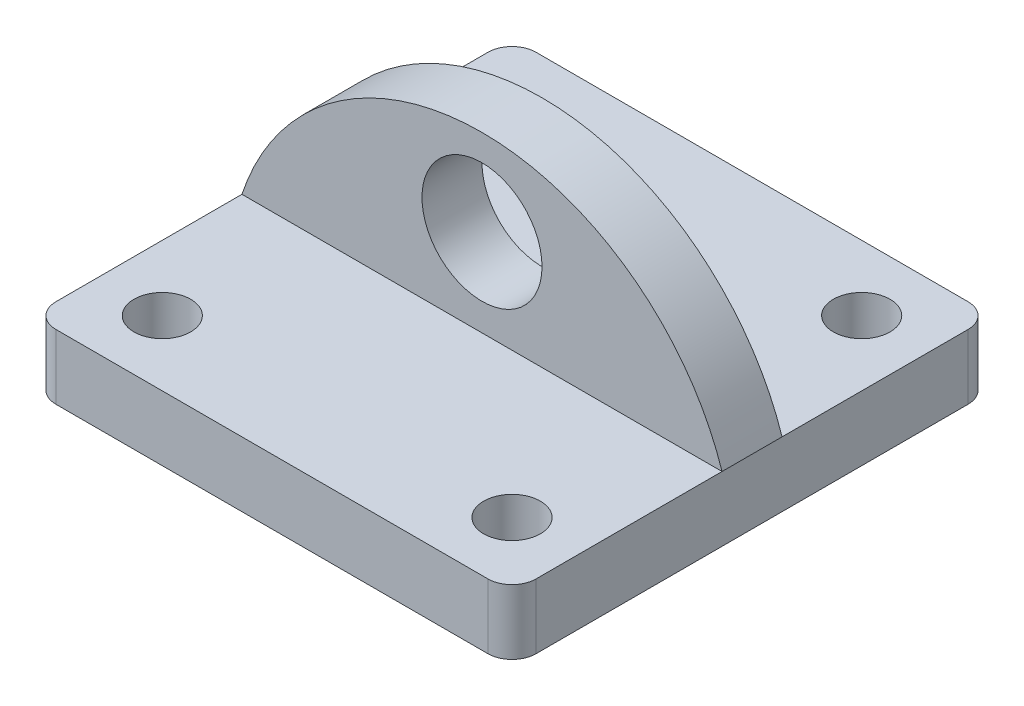
ISO-10303-21;
HEADER;
FILE_DESCRIPTION(('STEP AP214'),'2;1');
FILE_NAME('part.step','',(''),(''),'','','');
FILE_SCHEMA(('AUTOMOTIVE_DESIGN { 1 0 10303 214 1 1 1 1 }'));
ENDSEC;
DATA;
#1=APPLICATION_CONTEXT('core data for automotive mechanical design processes');
#2=APPLICATION_PROTOCOL_DEFINITION('international standard','automotive_design',2000,#1);
#3=PRODUCT_CONTEXT('',#1,'mechanical');
#4=PRODUCT('Part','Part','',(#3));
#5=PRODUCT_RELATED_PRODUCT_CATEGORY('part','',(#4));
#6=PRODUCT_DEFINITION_FORMATION('','',#4);
#7=PRODUCT_DEFINITION_CONTEXT('part definition',#1,'design');
#8=PRODUCT_DEFINITION('design','',#6,#7);
#9=PRODUCT_DEFINITION_SHAPE('','',#8);
#10=(LENGTH_UNIT() NAMED_UNIT(*) SI_UNIT(.MILLI.,.METRE.));
#11=(NAMED_UNIT(*) PLANE_ANGLE_UNIT() SI_UNIT($,.RADIAN.));
#12=(NAMED_UNIT(*) SI_UNIT($,.STERADIAN.) SOLID_ANGLE_UNIT());
#13=UNCERTAINTY_MEASURE_WITH_UNIT(LENGTH_MEASURE(1.E-05),#10,'distance_accuracy_value','');
#14=(GEOMETRIC_REPRESENTATION_CONTEXT(3) GLOBAL_UNCERTAINTY_ASSIGNED_CONTEXT((#13)) GLOBAL_UNIT_ASSIGNED_CONTEXT((#10,
#11,#12)) REPRESENTATION_CONTEXT('',''));
#15=CARTESIAN_POINT('',(0.,0.,0.));
#16=DIRECTION('',(0.,0.,1.));
#17=DIRECTION('',(1.,0.,0.));
#18=AXIS2_PLACEMENT_3D('',#15,#16,#17);
#19=CARTESIAN_POINT('',(0.,-1.51143345808905,-15.367));
#20=DIRECTION('',(0.,0.,1.));
#21=DIRECTION('',(1.,0.,0.));
#22=AXIS2_PLACEMENT_3D('',#19,#20,#21);
#23=CYLINDRICAL_SURFACE('',#22,26.7433620999563);
#24=DIRECTION('',(0.,0.,1.));
#25=VECTOR('',#24,1.);
#26=CARTESIAN_POINT('',(25.4,6.858,-15.367));
#27=LINE('',#26,#25);
#28=CARTESIAN_POINT('',(25.4,6.858,-3.17500000000001));
#29=VERTEX_POINT('',#28);
#30=CARTESIAN_POINT('',(25.4,6.85799999999999,3.17499999999999));
#31=VERTEX_POINT('',#30);
#32=EDGE_CURVE('E231',#29,#31,#27,.T.);
#33=ORIENTED_EDGE('',*,*,#32,.F.);
#34=CARTESIAN_POINT('',(0.,-1.51143345808905,-3.17500000000001));
#35=DIRECTION('',(0.,0.,-1.));
#36=DIRECTION('',(0.,1.,0.));
#37=AXIS2_PLACEMENT_3D('',#34,#35,#36);
#38=CIRCLE('',#37,26.7433620999563);
#39=CARTESIAN_POINT('',(-25.4,6.858,-3.17500000000001));
#40=VERTEX_POINT('',#39);
#41=EDGE_CURVE('E12',#40,#29,#38,.T.);
#42=ORIENTED_EDGE('',*,*,#41,.F.);
#43=DIRECTION('',(0.,0.,1.));
#44=VECTOR('',#43,1.);
#45=CARTESIAN_POINT('',(-25.4,6.858,-15.367));
#46=LINE('',#45,#44);
#47=CARTESIAN_POINT('',(-25.4,6.858,3.17499999999999));
#48=VERTEX_POINT('',#47);
#49=EDGE_CURVE('E232',#40,#48,#46,.T.);
#50=ORIENTED_EDGE('',*,*,#49,.T.);
#51=CARTESIAN_POINT('',(0.,-1.51143345808905,3.17499999999999));
#52=DIRECTION('',(0.,0.,-1.));
#53=DIRECTION('',(0.,1.,0.));
#54=AXIS2_PLACEMENT_3D('',#51,#52,#53);
#55=CIRCLE('',#54,26.7433620999563);
#56=EDGE_CURVE('E70',#48,#31,#55,.T.);
#57=ORIENTED_EDGE('',*,*,#56,.T.);
#58=EDGE_LOOP('',(#33,#42,#50,#57));
#59=FACE_BOUND('',#58,.T.);
#60=ADVANCED_FACE('F61',(#59),#23,.T.);
#61=CARTESIAN_POINT('',(-22.86,6.858,22.86));
#62=DIRECTION('',(0.,1.,0.));
#63=DIRECTION('',(0.,0.,1.));
#64=AXIS2_PLACEMENT_3D('',#61,#62,#63);
#65=PLANE('',#64);
#66=DIRECTION('',(0.,0.,1.));
#67=VECTOR('',#66,1.);
#68=CARTESIAN_POINT('',(-25.4,6.858,22.86));
#69=LINE('',#68,#67);
#70=CARTESIAN_POINT('',(-25.4,6.858,-22.86));
#71=VERTEX_POINT('',#70);
#72=EDGE_CURVE('E170',#71,#40,#69,.T.);
#73=ORIENTED_EDGE('',*,*,#72,.T.);
#74=DIRECTION('',(-1.,0.,0.));
#75=VECTOR('',#74,1.);
#76=CARTESIAN_POINT('',(32.766,6.858,-3.17500000000001));
#77=LINE('',#76,#75);
#78=EDGE_CURVE('E240',#29,#40,#77,.T.);
#79=ORIENTED_EDGE('',*,*,#78,.F.);
#80=DIRECTION('',(0.,0.,-1.));
#81=VECTOR('',#80,1.);
#82=CARTESIAN_POINT('',(25.4,6.858,22.86));
#83=LINE('',#82,#81);
#84=CARTESIAN_POINT('',(25.4,6.858,-22.86));
#85=VERTEX_POINT('',#84);
#86=EDGE_CURVE('E248',#29,#85,#83,.T.);
#87=ORIENTED_EDGE('',*,*,#86,.T.);
#88=CARTESIAN_POINT('',(22.86,6.858,-22.86));
#89=DIRECTION('',(0.,1.,0.));
#90=DIRECTION('',(0.,0.,1.));
#91=AXIS2_PLACEMENT_3D('',#88,#89,#90);
#92=CIRCLE('',#91,2.54);
#93=CARTESIAN_POINT('',(22.86,6.858,-25.4));
#94=VERTEX_POINT('',#93);
#95=EDGE_CURVE('E148',#85,#94,#92,.T.);
#96=ORIENTED_EDGE('',*,*,#95,.T.);
#97=DIRECTION('',(-1.,0.,0.));
#98=VECTOR('',#97,1.);
#99=CARTESIAN_POINT('',(22.86,6.858,-25.4));
#100=LINE('',#99,#98);
#101=CARTESIAN_POINT('',(-22.86,6.858,-25.4));
#102=VERTEX_POINT('',#101);
#103=EDGE_CURVE('E139',#94,#102,#100,.T.);
#104=ORIENTED_EDGE('',*,*,#103,.T.);
#105=CARTESIAN_POINT('',(-22.86,6.858,-22.86));
#106=DIRECTION('',(0.,1.,0.));
#107=DIRECTION('',(0.,0.,1.));
#108=AXIS2_PLACEMENT_3D('',#105,#106,#107);
#109=CIRCLE('',#108,2.54);
#110=EDGE_CURVE('E145',#102,#71,#109,.T.);
#111=ORIENTED_EDGE('',*,*,#110,.T.);
#112=EDGE_LOOP('',(#73,#79,#87,#96,#104,#111));
#113=FACE_BOUND('',#112,.T.);
#114=CARTESIAN_POINT('',(18.499963,6.858,-18.499963));
#115=DIRECTION('',(0.,1.,0.));
#116=DIRECTION('',(0.,0.,1.));
#117=AXIS2_PLACEMENT_3D('',#114,#115,#116);
#118=CIRCLE('',#117,2.999994);
#119=CARTESIAN_POINT('',(18.499963,6.858,-15.499969));
#120=VERTEX_POINT('',#119);
#121=EDGE_CURVE('E275',#120,#120,#118,.T.);
#122=ORIENTED_EDGE('',*,*,#121,.F.);
#123=EDGE_LOOP('',(#122));
#124=FACE_BOUND('',#123,.T.);
#125=CARTESIAN_POINT('',(-18.499963,6.858,-18.499963));
#126=DIRECTION('',(0.,1.,0.));
#127=DIRECTION('',(0.,0.,1.));
#128=AXIS2_PLACEMENT_3D('',#125,#126,#127);
#129=CIRCLE('',#128,2.999994);
#130=CARTESIAN_POINT('',(-18.499963,6.858,-15.499969));
#131=VERTEX_POINT('',#130);
#132=EDGE_CURVE('E181',#131,#131,#129,.T.);
#133=ORIENTED_EDGE('',*,*,#132,.F.);
#134=EDGE_LOOP('',(#133));
#135=FACE_BOUND('',#134,.T.);
#136=ADVANCED_FACE('F142',(#113,#124,#135),#65,.T.);
#137=CARTESIAN_POINT('',(25.4,6.858,22.86));
#138=VERTEX_POINT('',#137);
#139=EDGE_CURVE('E246',#138,#31,#83,.T.);
#140=ORIENTED_EDGE('',*,*,#139,.T.);
#141=DIRECTION('',(-1.,0.,0.));
#142=VECTOR('',#141,1.);
#143=CARTESIAN_POINT('',(32.766,6.858,3.17499999999999));
#144=LINE('',#143,#142);
#145=EDGE_CURVE('E236',#31,#48,#144,.T.);
#146=ORIENTED_EDGE('',*,*,#145,.T.);
#147=CARTESIAN_POINT('',(-25.4,6.858,22.86));
#148=VERTEX_POINT('',#147);
#149=EDGE_CURVE('E77',#48,#148,#69,.T.);
#150=ORIENTED_EDGE('',*,*,#149,.T.);
#151=CARTESIAN_POINT('',(-22.86,6.858,22.86));
#152=DIRECTION('',(0.,1.,0.));
#153=DIRECTION('',(0.,0.,1.));
#154=AXIS2_PLACEMENT_3D('',#151,#152,#153);
#155=CIRCLE('',#154,2.54);
#156=CARTESIAN_POINT('',(-22.86,6.858,25.4));
#157=VERTEX_POINT('',#156);
#158=EDGE_CURVE('E200',#148,#157,#155,.T.);
#159=ORIENTED_EDGE('',*,*,#158,.T.);
#160=DIRECTION('',(1.,0.,0.));
#161=VECTOR('',#160,1.);
#162=CARTESIAN_POINT('',(22.86,6.858,25.4));
#163=LINE('',#162,#161);
#164=CARTESIAN_POINT('',(22.86,6.858,25.4));
#165=VERTEX_POINT('',#164);
#166=EDGE_CURVE('E123',#157,#165,#163,.T.);
#167=ORIENTED_EDGE('',*,*,#166,.T.);
#168=CARTESIAN_POINT('',(22.86,6.858,22.86));
#169=DIRECTION('',(0.,1.,0.));
#170=DIRECTION('',(0.,0.,-1.));
#171=AXIS2_PLACEMENT_3D('',#168,#169,#170);
#172=CIRCLE('',#171,2.54);
#173=EDGE_CURVE('E293',#165,#138,#172,.T.);
#174=ORIENTED_EDGE('',*,*,#173,.T.);
#175=EDGE_LOOP('',(#140,#146,#150,#159,#167,#174));
#176=FACE_BOUND('',#175,.T.);
#177=CARTESIAN_POINT('',(18.499963,6.858,18.499963));
#178=DIRECTION('',(0.,1.,0.));
#179=DIRECTION('',(0.,0.,1.));
#180=AXIS2_PLACEMENT_3D('',#177,#178,#179);
#181=CIRCLE('',#180,2.999994);
#182=CARTESIAN_POINT('',(18.499963,6.858,21.499957));
#183=VERTEX_POINT('',#182);
#184=EDGE_CURVE('E267',#183,#183,#181,.T.);
#185=ORIENTED_EDGE('',*,*,#184,.F.);
#186=EDGE_LOOP('',(#185));
#187=FACE_BOUND('',#186,.T.);
#188=CARTESIAN_POINT('',(-18.499963,6.858,18.499963));
#189=DIRECTION('',(0.,1.,0.));
#190=DIRECTION('',(0.,0.,1.));
#191=AXIS2_PLACEMENT_3D('',#188,#189,#190);
#192=CIRCLE('',#191,2.999994);
#193=CARTESIAN_POINT('',(-18.499963,6.858,21.499957));
#194=VERTEX_POINT('',#193);
#195=EDGE_CURVE('E256',#194,#194,#192,.T.);
#196=ORIENTED_EDGE('',*,*,#195,.F.);
#197=EDGE_LOOP('',(#196));
#198=FACE_BOUND('',#197,.T.);
#199=ADVANCED_FACE('F338',(#176,#187,#198),#65,.T.);
#200=CARTESIAN_POINT('',(-22.86,0.,22.86));
#201=DIRECTION('',(0.,1.,0.));
#202=DIRECTION('',(0.,0.,1.));
#203=AXIS2_PLACEMENT_3D('',#200,#201,#202);
#204=PLANE('',#203);
#205=CARTESIAN_POINT('',(-22.86,0.,22.86));
#206=DIRECTION('',(0.,1.,0.));
#207=DIRECTION('',(0.,0.,1.));
#208=AXIS2_PLACEMENT_3D('',#205,#206,#207);
#209=CIRCLE('',#208,2.54);
#210=CARTESIAN_POINT('',(-25.4,0.,22.86));
#211=VERTEX_POINT('',#210);
#212=CARTESIAN_POINT('',(-22.86,0.,25.4));
#213=VERTEX_POINT('',#212);
#214=EDGE_CURVE('E176',#211,#213,#209,.T.);
#215=ORIENTED_EDGE('',*,*,#214,.F.);
#216=DIRECTION('',(0.,0.,1.));
#217=VECTOR('',#216,1.);
#218=CARTESIAN_POINT('',(-25.4,0.,22.86));
#219=LINE('',#218,#217);
#220=CARTESIAN_POINT('',(-25.4,0.,-22.86));
#221=VERTEX_POINT('',#220);
#222=EDGE_CURVE('E114',#221,#211,#219,.T.);
#223=ORIENTED_EDGE('',*,*,#222,.F.);
#224=CARTESIAN_POINT('',(-22.86,0.,-22.86));
#225=DIRECTION('',(0.,1.,0.));
#226=DIRECTION('',(0.,0.,1.));
#227=AXIS2_PLACEMENT_3D('',#224,#225,#226);
#228=CIRCLE('',#227,2.54);
#229=CARTESIAN_POINT('',(-22.86,0.,-25.4));
#230=VERTEX_POINT('',#229);
#231=EDGE_CURVE('E195',#230,#221,#228,.T.);
#232=ORIENTED_EDGE('',*,*,#231,.F.);
#233=DIRECTION('',(-1.,0.,0.));
#234=VECTOR('',#233,1.);
#235=CARTESIAN_POINT('',(22.86,0.,-25.4));
#236=LINE('',#235,#234);
#237=CARTESIAN_POINT('',(22.86,0.,-25.4));
#238=VERTEX_POINT('',#237);
#239=EDGE_CURVE('E158',#238,#230,#236,.T.);
#240=ORIENTED_EDGE('',*,*,#239,.F.);
#241=CARTESIAN_POINT('',(22.86,0.,-22.86));
#242=DIRECTION('',(0.,1.,0.));
#243=DIRECTION('',(0.,0.,1.));
#244=AXIS2_PLACEMENT_3D('',#241,#242,#243);
#245=CIRCLE('',#244,2.54);
#246=CARTESIAN_POINT('',(25.4,0.,-22.86));
#247=VERTEX_POINT('',#246);
#248=EDGE_CURVE('E190',#247,#238,#245,.T.);
#249=ORIENTED_EDGE('',*,*,#248,.F.);
#250=DIRECTION('',(0.,0.,-1.));
#251=VECTOR('',#250,1.);
#252=CARTESIAN_POINT('',(25.4,0.,22.86));
#253=LINE('',#252,#251);
#254=CARTESIAN_POINT('',(25.4,0.,22.86));
#255=VERTEX_POINT('',#254);
#256=EDGE_CURVE('E187',#255,#247,#253,.T.);
#257=ORIENTED_EDGE('',*,*,#256,.F.);
#258=CARTESIAN_POINT('',(22.86,0.,22.86));
#259=DIRECTION('',(0.,1.,0.));
#260=DIRECTION('',(0.,0.,-1.));
#261=AXIS2_PLACEMENT_3D('',#258,#259,#260);
#262=CIRCLE('',#261,2.54);
#263=CARTESIAN_POINT('',(22.86,0.,25.4));
#264=VERTEX_POINT('',#263);
#265=EDGE_CURVE('E184',#264,#255,#262,.T.);
#266=ORIENTED_EDGE('',*,*,#265,.F.);
#267=DIRECTION('',(1.,0.,0.));
#268=VECTOR('',#267,1.);
#269=CARTESIAN_POINT('',(22.86,0.,25.4));
#270=LINE('',#269,#268);
#271=EDGE_CURVE('E180',#213,#264,#270,.T.);
#272=ORIENTED_EDGE('',*,*,#271,.F.);
#273=EDGE_LOOP('',(#215,#223,#232,#240,#249,#257,#266,#272));
#274=FACE_BOUND('',#273,.T.);
#275=CARTESIAN_POINT('',(-18.499963,0.,-18.499963));
#276=DIRECTION('',(0.,1.,0.));
#277=DIRECTION('',(0.,0.,1.));
#278=AXIS2_PLACEMENT_3D('',#275,#276,#277);
#279=CIRCLE('',#278,2.999994);
#280=CARTESIAN_POINT('',(-18.499963,0.,-15.499969));
#281=VERTEX_POINT('',#280);
#282=EDGE_CURVE('E279',#281,#281,#279,.T.);
#283=ORIENTED_EDGE('',*,*,#282,.T.);
#284=EDGE_LOOP('',(#283));
#285=FACE_BOUND('',#284,.T.);
#286=CARTESIAN_POINT('',(18.499963,0.,-18.499963));
#287=DIRECTION('',(0.,1.,0.));
#288=DIRECTION('',(0.,0.,1.));
#289=AXIS2_PLACEMENT_3D('',#286,#287,#288);
#290=CIRCLE('',#289,2.999994);
#291=CARTESIAN_POINT('',(18.499963,0.,-15.499969));
#292=VERTEX_POINT('',#291);
#293=EDGE_CURVE('E271',#292,#292,#290,.T.);
#294=ORIENTED_EDGE('',*,*,#293,.T.);
#295=EDGE_LOOP('',(#294));
#296=FACE_BOUND('',#295,.T.);
#297=CARTESIAN_POINT('',(18.499963,0.,18.499963));
#298=DIRECTION('',(0.,1.,0.));
#299=DIRECTION('',(0.,0.,1.));
#300=AXIS2_PLACEMENT_3D('',#297,#298,#299);
#301=CIRCLE('',#300,2.999994);
#302=CARTESIAN_POINT('',(18.499963,0.,21.499957));
#303=VERTEX_POINT('',#302);
#304=EDGE_CURVE('E265',#303,#303,#301,.T.);
#305=ORIENTED_EDGE('',*,*,#304,.T.);
#306=EDGE_LOOP('',(#305));
#307=FACE_BOUND('',#306,.T.);
#308=CARTESIAN_POINT('',(-18.499963,0.,18.499963));
#309=DIRECTION('',(0.,1.,0.));
#310=DIRECTION('',(0.,0.,1.));
#311=AXIS2_PLACEMENT_3D('',#308,#309,#310);
#312=CIRCLE('',#311,2.999994);
#313=CARTESIAN_POINT('',(-18.499963,0.,21.499957));
#314=VERTEX_POINT('',#313);
#315=EDGE_CURVE('E251',#314,#314,#312,.T.);
#316=ORIENTED_EDGE('',*,*,#315,.T.);
#317=EDGE_LOOP('',(#316));
#318=FACE_BOUND('',#317,.T.);
#319=ADVANCED_FACE('F306',(#274,#285,#296,#307,#318),#204,.F.);
#320=CARTESIAN_POINT('',(-22.86,6.858,22.86));
#321=DIRECTION('',(0.,-1.,0.));
#322=DIRECTION('',(0.,0.,-1.));
#323=AXIS2_PLACEMENT_3D('',#320,#321,#322);
#324=CYLINDRICAL_SURFACE('',#323,2.54);
#325=ORIENTED_EDGE('',*,*,#214,.T.);
#326=DIRECTION('',(0.,-1.,0.));
#327=VECTOR('',#326,1.);
#328=CARTESIAN_POINT('',(-22.86,6.858,25.4));
#329=LINE('',#328,#327);
#330=EDGE_CURVE('E219',#157,#213,#329,.T.);
#331=ORIENTED_EDGE('',*,*,#330,.F.);
#332=ORIENTED_EDGE('',*,*,#158,.F.);
#333=DIRECTION('',(0.,-1.,0.));
#334=VECTOR('',#333,1.);
#335=CARTESIAN_POINT('',(-25.4,6.858,22.86));
#336=LINE('',#335,#334);
#337=EDGE_CURVE('E175',#148,#211,#336,.T.);
#338=ORIENTED_EDGE('',*,*,#337,.T.);
#339=EDGE_LOOP('',(#325,#331,#332,#338));
#340=FACE_BOUND('',#339,.T.);
#341=ADVANCED_FACE('F63',(#340),#324,.T.);
#342=CARTESIAN_POINT('',(22.86,6.858,25.4));
#343=DIRECTION('',(0.,0.,-1.));
#344=DIRECTION('',(-1.,0.,0.));
#345=AXIS2_PLACEMENT_3D('',#342,#343,#344);
#346=PLANE('',#345);
#347=ORIENTED_EDGE('',*,*,#271,.T.);
#348=DIRECTION('',(0.,-1.,0.));
#349=VECTOR('',#348,1.);
#350=CARTESIAN_POINT('',(22.86,6.858,25.4));
#351=LINE('',#350,#349);
#352=EDGE_CURVE('E215',#165,#264,#351,.T.);
#353=ORIENTED_EDGE('',*,*,#352,.F.);
#354=ORIENTED_EDGE('',*,*,#166,.F.);
#355=ORIENTED_EDGE('',*,*,#330,.T.);
#356=EDGE_LOOP('',(#347,#353,#354,#355));
#357=FACE_BOUND('',#356,.T.);
#358=ADVANCED_FACE('F377',(#357),#346,.F.);
#359=CARTESIAN_POINT('',(22.86,6.858,22.86));
#360=DIRECTION('',(0.,-1.,0.));
#361=DIRECTION('',(0.,0.,-1.));
#362=AXIS2_PLACEMENT_3D('',#359,#360,#361);
#363=CYLINDRICAL_SURFACE('',#362,2.54);
#364=ORIENTED_EDGE('',*,*,#265,.T.);
#365=DIRECTION('',(0.,-1.,0.));
#366=VECTOR('',#365,1.);
#367=CARTESIAN_POINT('',(25.4,6.858,22.86));
#368=LINE('',#367,#366);
#369=EDGE_CURVE('E211',#138,#255,#368,.T.);
#370=ORIENTED_EDGE('',*,*,#369,.F.);
#371=ORIENTED_EDGE('',*,*,#173,.F.);
#372=ORIENTED_EDGE('',*,*,#352,.T.);
#373=EDGE_LOOP('',(#364,#370,#371,#372));
#374=FACE_BOUND('',#373,.T.);
#375=ADVANCED_FACE('F375',(#374),#363,.T.);
#376=CARTESIAN_POINT('',(25.4,6.858,22.86));
#377=DIRECTION('',(-1.,0.,0.));
#378=DIRECTION('',(0.,0.,1.));
#379=AXIS2_PLACEMENT_3D('',#376,#377,#378);
#380=PLANE('',#379);
#381=ORIENTED_EDGE('',*,*,#86,.F.);
#382=ORIENTED_EDGE('',*,*,#32,.T.);
#383=ORIENTED_EDGE('',*,*,#139,.F.);
#384=ORIENTED_EDGE('',*,*,#369,.T.);
#385=ORIENTED_EDGE('',*,*,#256,.T.);
#386=DIRECTION('',(0.,-1.,0.));
#387=VECTOR('',#386,1.);
#388=CARTESIAN_POINT('',(25.4,6.858,-22.86));
#389=LINE('',#388,#387);
#390=EDGE_CURVE('E207',#85,#247,#389,.T.);
#391=ORIENTED_EDGE('',*,*,#390,.F.);
#392=EDGE_LOOP('',(#381,#382,#383,#384,#385,#391));
#393=FACE_BOUND('',#392,.T.);
#394=ADVANCED_FACE('F245',(#393),#380,.F.);
#395=CARTESIAN_POINT('',(22.86,6.858,-22.86));
#396=DIRECTION('',(0.,-1.,0.));
#397=DIRECTION('',(0.,0.,-1.));
#398=AXIS2_PLACEMENT_3D('',#395,#396,#397);
#399=CYLINDRICAL_SURFACE('',#398,2.54);
#400=ORIENTED_EDGE('',*,*,#248,.T.);
#401=DIRECTION('',(0.,-1.,0.));
#402=VECTOR('',#401,1.);
#403=CARTESIAN_POINT('',(22.86,6.858,-25.4));
#404=LINE('',#403,#402);
#405=EDGE_CURVE('E162',#94,#238,#404,.T.);
#406=ORIENTED_EDGE('',*,*,#405,.F.);
#407=ORIENTED_EDGE('',*,*,#95,.F.);
#408=ORIENTED_EDGE('',*,*,#390,.T.);
#409=EDGE_LOOP('',(#400,#406,#407,#408));
#410=FACE_BOUND('',#409,.T.);
#411=ADVANCED_FACE('F303',(#410),#399,.T.);
#412=CARTESIAN_POINT('',(22.86,6.858,-25.4));
#413=DIRECTION('',(0.,0.,1.));
#414=DIRECTION('',(1.,0.,0.));
#415=AXIS2_PLACEMENT_3D('',#412,#413,#414);
#416=PLANE('',#415);
#417=ORIENTED_EDGE('',*,*,#239,.T.);
#418=DIRECTION('',(0.,-1.,0.));
#419=VECTOR('',#418,1.);
#420=CARTESIAN_POINT('',(-22.86,6.858,-25.4));
#421=LINE('',#420,#419);
#422=EDGE_CURVE('E155',#102,#230,#421,.T.);
#423=ORIENTED_EDGE('',*,*,#422,.F.);
#424=ORIENTED_EDGE('',*,*,#103,.F.);
#425=ORIENTED_EDGE('',*,*,#405,.T.);
#426=EDGE_LOOP('',(#417,#423,#424,#425));
#427=FACE_BOUND('',#426,.T.);
#428=ADVANCED_FACE('F156',(#427),#416,.F.);
#429=CARTESIAN_POINT('',(-22.86,6.858,-22.86));
#430=DIRECTION('',(0.,-1.,0.));
#431=DIRECTION('',(0.,0.,-1.));
#432=AXIS2_PLACEMENT_3D('',#429,#430,#431);
#433=CYLINDRICAL_SURFACE('',#432,2.54);
#434=ORIENTED_EDGE('',*,*,#231,.T.);
#435=DIRECTION('',(0.,-1.,0.));
#436=VECTOR('',#435,1.);
#437=CARTESIAN_POINT('',(-25.4,6.858,-22.86));
#438=LINE('',#437,#436);
#439=EDGE_CURVE('E163',#71,#221,#438,.T.);
#440=ORIENTED_EDGE('',*,*,#439,.F.);
#441=ORIENTED_EDGE('',*,*,#110,.F.);
#442=ORIENTED_EDGE('',*,*,#422,.T.);
#443=EDGE_LOOP('',(#434,#440,#441,#442));
#444=FACE_BOUND('',#443,.T.);
#445=ADVANCED_FACE('F165',(#444),#433,.T.);
#446=CARTESIAN_POINT('',(-25.4,6.858,22.86));
#447=DIRECTION('',(1.,0.,0.));
#448=DIRECTION('',(0.,0.,-1.));
#449=AXIS2_PLACEMENT_3D('',#446,#447,#448);
#450=PLANE('',#449);
#451=ORIENTED_EDGE('',*,*,#149,.F.);
#452=ORIENTED_EDGE('',*,*,#49,.F.);
#453=ORIENTED_EDGE('',*,*,#72,.F.);
#454=ORIENTED_EDGE('',*,*,#439,.T.);
#455=ORIENTED_EDGE('',*,*,#222,.T.);
#456=ORIENTED_EDGE('',*,*,#337,.F.);
#457=EDGE_LOOP('',(#451,#452,#453,#454,#455,#456));
#458=FACE_BOUND('',#457,.T.);
#459=ADVANCED_FACE('F308',(#458),#450,.F.);
#460=CARTESIAN_POINT('',(-18.499963,6.858,-18.499963));
#461=DIRECTION('',(0.,-1.,0.));
#462=DIRECTION('',(0.,0.,-1.));
#463=AXIS2_PLACEMENT_3D('',#460,#461,#462);
#464=CYLINDRICAL_SURFACE('',#463,2.999994);
#465=ORIENTED_EDGE('',*,*,#132,.T.);
#466=EDGE_LOOP('',(#465));
#467=FACE_BOUND('',#466,.T.);
#468=ORIENTED_EDGE('',*,*,#282,.F.);
#469=EDGE_LOOP('',(#468));
#470=FACE_BOUND('',#469,.T.);
#471=ADVANCED_FACE('F358',(#467,#470),#464,.F.);
#472=CARTESIAN_POINT('',(18.499963,6.858,-18.499963));
#473=DIRECTION('',(0.,-1.,0.));
#474=DIRECTION('',(0.,0.,-1.));
#475=AXIS2_PLACEMENT_3D('',#472,#473,#474);
#476=CYLINDRICAL_SURFACE('',#475,2.999994);
#477=ORIENTED_EDGE('',*,*,#121,.T.);
#478=EDGE_LOOP('',(#477));
#479=FACE_BOUND('',#478,.T.);
#480=ORIENTED_EDGE('',*,*,#293,.F.);
#481=EDGE_LOOP('',(#480));
#482=FACE_BOUND('',#481,.T.);
#483=ADVANCED_FACE('F351',(#479,#482),#476,.F.);
#484=CARTESIAN_POINT('',(18.499963,6.858,18.499963));
#485=DIRECTION('',(0.,-1.,0.));
#486=DIRECTION('',(0.,0.,-1.));
#487=AXIS2_PLACEMENT_3D('',#484,#485,#486);
#488=CYLINDRICAL_SURFACE('',#487,2.999994);
#489=ORIENTED_EDGE('',*,*,#184,.T.);
#490=EDGE_LOOP('',(#489));
#491=FACE_BOUND('',#490,.T.);
#492=ORIENTED_EDGE('',*,*,#304,.F.);
#493=EDGE_LOOP('',(#492));
#494=FACE_BOUND('',#493,.T.);
#495=ADVANCED_FACE('F346',(#491,#494),#488,.F.);
#496=CARTESIAN_POINT('',(-18.499963,6.858,18.499963));
#497=DIRECTION('',(0.,-1.,0.));
#498=DIRECTION('',(0.,0.,-1.));
#499=AXIS2_PLACEMENT_3D('',#496,#497,#498);
#500=CYLINDRICAL_SURFACE('',#499,2.999994);
#501=ORIENTED_EDGE('',*,*,#195,.T.);
#502=EDGE_LOOP('',(#501));
#503=FACE_BOUND('',#502,.T.);
#504=ORIENTED_EDGE('',*,*,#315,.F.);
#505=EDGE_LOOP('',(#504));
#506=FACE_BOUND('',#505,.T.);
#507=ADVANCED_FACE('F342',(#503,#506),#500,.F.);
#508=CARTESIAN_POINT('',(32.766,0.,3.17499999999999));
#509=DIRECTION('',(0.,0.,-1.));
#510=DIRECTION('',(0.,1.,0.));
#511=AXIS2_PLACEMENT_3D('',#508,#509,#510);
#512=PLANE('',#511);
#513=ORIENTED_EDGE('',*,*,#56,.F.);
#514=ORIENTED_EDGE('',*,*,#145,.F.);
#515=EDGE_LOOP('',(#513,#514));
#516=FACE_BOUND('',#515,.T.);
#517=CARTESIAN_POINT('',(0.,16.1032174785401,3.17499999999999));
#518=DIRECTION('',(0.,0.,-1.));
#519=DIRECTION('',(0.,1.,0.));
#520=AXIS2_PLACEMENT_3D('',#517,#518,#519);
#521=CIRCLE('',#520,6.35);
#522=CARTESIAN_POINT('',(6.34999999999999,16.1032174785401,3.17499999999999));
#523=VERTEX_POINT('',#522);
#524=EDGE_CURVE('E314',#523,#523,#521,.F.);
#525=ORIENTED_EDGE('',*,*,#524,.F.);
#526=EDGE_LOOP('',(#525));
#527=FACE_BOUND('',#526,.T.);
#528=ADVANCED_FACE('F237',(#516,#527),#512,.F.);
#529=CARTESIAN_POINT('',(32.766,0.,-3.17500000000001));
#530=DIRECTION('',(0.,0.,-1.));
#531=DIRECTION('',(0.,1.,0.));
#532=AXIS2_PLACEMENT_3D('',#529,#530,#531);
#533=PLANE('',#532);
#534=ORIENTED_EDGE('',*,*,#41,.T.);
#535=ORIENTED_EDGE('',*,*,#78,.T.);
#536=EDGE_LOOP('',(#534,#535));
#537=FACE_BOUND('',#536,.T.);
#538=CARTESIAN_POINT('',(0.,16.1032174785401,-3.17500000000001));
#539=DIRECTION('',(0.,0.,-1.));
#540=DIRECTION('',(0.,1.,0.));
#541=AXIS2_PLACEMENT_3D('',#538,#539,#540);
#542=CIRCLE('',#541,6.35);
#543=CARTESIAN_POINT('',(6.34999999999999,16.1032174785401,-3.17500000000001));
#544=VERTEX_POINT('',#543);
#545=EDGE_CURVE('E258',#544,#544,#542,.F.);
#546=ORIENTED_EDGE('',*,*,#545,.T.);
#547=EDGE_LOOP('',(#546));
#548=FACE_BOUND('',#547,.T.);
#549=ADVANCED_FACE('F311',(#537,#548),#533,.T.);
#550=CARTESIAN_POINT('',(0.,16.1032174785401,-15.367));
#551=DIRECTION('',(0.,0.,1.));
#552=DIRECTION('',(1.,0.,0.));
#553=AXIS2_PLACEMENT_3D('',#550,#551,#552);
#554=CYLINDRICAL_SURFACE('',#553,6.35);
#555=CARTESIAN_POINT('',(6.34999999999999,16.1032174785401,3.17499999999999));
#556=CARTESIAN_POINT('',(6.34999999999999,16.1032174785401,3.10885416666665));
#557=CARTESIAN_POINT('',(6.34999999999999,16.1032174785401,3.04270833333332));
#558=CARTESIAN_POINT('',(6.34999999999999,16.1032174785401,2.91041666666665));
#559=CARTESIAN_POINT('',(6.34999999999999,16.1032174785401,2.84427083333332));
#560=CARTESIAN_POINT('',(6.34999999999999,16.1032174785401,2.71197916666665));
#561=CARTESIAN_POINT('',(6.34999999999999,16.1032174785401,2.64583333333332));
#562=CARTESIAN_POINT('',(6.34999999999999,16.1032174785401,2.51354166666665));
#563=CARTESIAN_POINT('',(6.34999999999999,16.1032174785401,2.44739583333332));
#564=CARTESIAN_POINT('',(6.34999999999999,16.1032174785401,2.31510416666665));
#565=CARTESIAN_POINT('',(6.34999999999999,16.1032174785401,2.24895833333332));
#566=CARTESIAN_POINT('',(6.34999999999999,16.1032174785401,2.11666666666665));
#567=CARTESIAN_POINT('',(6.34999999999999,16.1032174785401,2.05052083333332));
#568=CARTESIAN_POINT('',(6.34999999999999,16.1032174785401,1.91822916666665));
#569=CARTESIAN_POINT('',(6.34999999999999,16.1032174785401,1.85208333333332));
#570=CARTESIAN_POINT('',(6.34999999999999,16.1032174785401,1.71979166666665));
#571=CARTESIAN_POINT('',(6.34999999999999,16.1032174785401,1.65364583333332));
#572=CARTESIAN_POINT('',(6.34999999999999,16.1032174785401,1.52135416666665));
#573=CARTESIAN_POINT('',(6.34999999999999,16.1032174785401,1.45520833333332));
#574=CARTESIAN_POINT('',(6.34999999999999,16.1032174785401,1.32291666666665));
#575=CARTESIAN_POINT('',(6.34999999999999,16.1032174785401,1.25677083333332));
#576=CARTESIAN_POINT('',(6.34999999999999,16.1032174785401,1.12447916666665));
#577=CARTESIAN_POINT('',(6.34999999999999,16.1032174785401,1.05833333333332));
#578=CARTESIAN_POINT('',(6.34999999999999,16.1032174785401,0.926041666666654));
#579=CARTESIAN_POINT('',(6.34999999999999,16.1032174785401,0.85989583333332));
#580=CARTESIAN_POINT('',(6.34999999999999,16.1032174785401,0.727604166666652));
#581=CARTESIAN_POINT('',(6.34999999999999,16.1032174785401,0.661458333333319));
#582=CARTESIAN_POINT('',(6.34999999999999,16.1032174785401,0.529166666666653));
#583=CARTESIAN_POINT('',(6.34999999999999,16.1032174785401,0.463020833333321));
#584=CARTESIAN_POINT('',(6.34999999999999,16.1032174785401,0.330729166666653));
#585=CARTESIAN_POINT('',(6.34999999999999,16.1032174785401,0.264583333333319));
#586=CARTESIAN_POINT('',(6.34999999999999,16.1032174785401,0.132291666666652));
#587=CARTESIAN_POINT('',(6.34999999999999,16.1032174785401,0.0661458333333191));
#588=CARTESIAN_POINT('',(6.34999999999999,16.1032174785401,-0.0661458333333469));
#589=CARTESIAN_POINT('',(6.34999999999999,16.1032174785401,-0.13229166666668));
#590=CARTESIAN_POINT('',(6.34999999999999,16.1032174785401,-0.264583333333346));
#591=CARTESIAN_POINT('',(6.34999999999999,16.1032174785401,-0.33072916666668));
#592=CARTESIAN_POINT('',(6.34999999999999,16.1032174785401,-0.463020833333347));
#593=CARTESIAN_POINT('',(6.34999999999999,16.1032174785401,-0.529166666666681));
#594=CARTESIAN_POINT('',(6.34999999999999,16.1032174785401,-0.661458333333347));
#595=CARTESIAN_POINT('',(6.34999999999999,16.1032174785401,-0.72760416666668));
#596=CARTESIAN_POINT('',(6.34999999999999,16.1032174785401,-0.859895833333347));
#597=CARTESIAN_POINT('',(6.34999999999999,16.1032174785401,-0.92604166666668));
#598=CARTESIAN_POINT('',(6.34999999999999,16.1032174785401,-1.05833333333335));
#599=CARTESIAN_POINT('',(6.34999999999999,16.1032174785401,-1.12447916666668));
#600=CARTESIAN_POINT('',(6.34999999999999,16.1032174785401,-1.25677083333335));
#601=CARTESIAN_POINT('',(6.34999999999999,16.1032174785401,-1.32291666666668));
#602=CARTESIAN_POINT('',(6.34999999999999,16.1032174785401,-1.45520833333335));
#603=CARTESIAN_POINT('',(6.34999999999999,16.1032174785401,-1.52135416666668));
#604=CARTESIAN_POINT('',(6.34999999999999,16.1032174785401,-1.65364583333335));
#605=CARTESIAN_POINT('',(6.34999999999999,16.1032174785401,-1.71979166666668));
#606=CARTESIAN_POINT('',(6.34999999999999,16.1032174785401,-1.85208333333335));
#607=CARTESIAN_POINT('',(6.34999999999999,16.1032174785401,-1.91822916666668));
#608=CARTESIAN_POINT('',(6.34999999999999,16.1032174785401,-2.05052083333335));
#609=CARTESIAN_POINT('',(6.34999999999999,16.1032174785401,-2.11666666666668));
#610=CARTESIAN_POINT('',(6.34999999999999,16.1032174785401,-2.24895833333335));
#611=CARTESIAN_POINT('',(6.34999999999999,16.1032174785401,-2.31510416666668));
#612=CARTESIAN_POINT('',(6.34999999999999,16.1032174785401,-2.44739583333335));
#613=CARTESIAN_POINT('',(6.34999999999999,16.1032174785401,-2.51354166666668));
#614=CARTESIAN_POINT('',(6.34999999999999,16.1032174785401,-2.64583333333335));
#615=CARTESIAN_POINT('',(6.34999999999999,16.1032174785401,-2.71197916666668));
#616=CARTESIAN_POINT('',(6.34999999999999,16.1032174785401,-2.84427083333335));
#617=CARTESIAN_POINT('',(6.34999999999999,16.1032174785401,-2.91041666666668));
#618=CARTESIAN_POINT('',(6.34999999999999,16.1032174785401,-3.04270833333335));
#619=CARTESIAN_POINT('',(6.34999999999999,16.1032174785401,-3.10885416666668));
#620=CARTESIAN_POINT('',(6.34999999999999,16.1032174785401,-3.17500000000001));
#621=B_SPLINE_CURVE_WITH_KNOTS('',3,(#555,#556,#557,#558,#559,#560,#561,#562,#563,#564,#565,
#566,#567,#568,#569,#570,#571,#572,#573,#574,#575,#576,#577,#578,#579,#580,#581,#582,#583,#584,
#585,#586,#587,#588,#589,#590,#591,#592,#593,#594,#595,#596,#597,#598,#599,#600,#601,#602,#603,
#604,#605,#606,#607,#608,#609,#610,#611,#612,#613,#614,#615,#616,#617,#618,#619,#620),
.UNSPECIFIED.,.F.,.F.,(4,2,2,2,2,2,2,2,2,2,2,2,2,2,2,2,2,2,2,2,2,2,2,2,2,2,2,2,2,2,2,2,4),(0.,
0.198437499999999,0.396875000000001,0.5953125,0.793749999999999,0.992187500000002,1.190625,
1.3890625,1.5875,1.7859375,1.984375,2.1828125,2.38125,2.5796875,2.778125,2.9765625,3.175,
3.3734375,3.571875,3.7703125,3.96875,4.1671875,4.365625,4.5640625,4.7625,4.9609375,5.159375,
5.3578125,5.55625,5.7546875,5.953125,6.1515625,6.35),.UNSPECIFIED.);
#622=EDGE_CURVE('BSEAM324',#523,#544,#621,.T.);
#623=ORIENTED_EDGE('',*,*,#524,.T.);
#624=ORIENTED_EDGE('',*,*,#545,.F.);
#625=ORIENTED_EDGE('',*,*,#622,.T.);
#626=ORIENTED_EDGE('',*,*,#622,.F.);
#627=EDGE_LOOP('',(#623,#625,#624,#626));
#628=FACE_BOUND('',#627,.T.);
#629=ADVANCED_FACE('F324',(#628),#554,.F.);
#630=CLOSED_SHELL('',(#60,#136,#199,#319,#341,#358,#375,#394,#411,#428,#445,#459,#471,#483,#495,
#507,#528,#549,#629));
#631=MANIFOLD_SOLID_BREP('B2',#630);
#632=ADVANCED_BREP_SHAPE_REPRESENTATION('',(#18,#631),#14);
#633=SHAPE_DEFINITION_REPRESENTATION(#9,#632);
ENDSEC;
END-ISO-10303-21;
